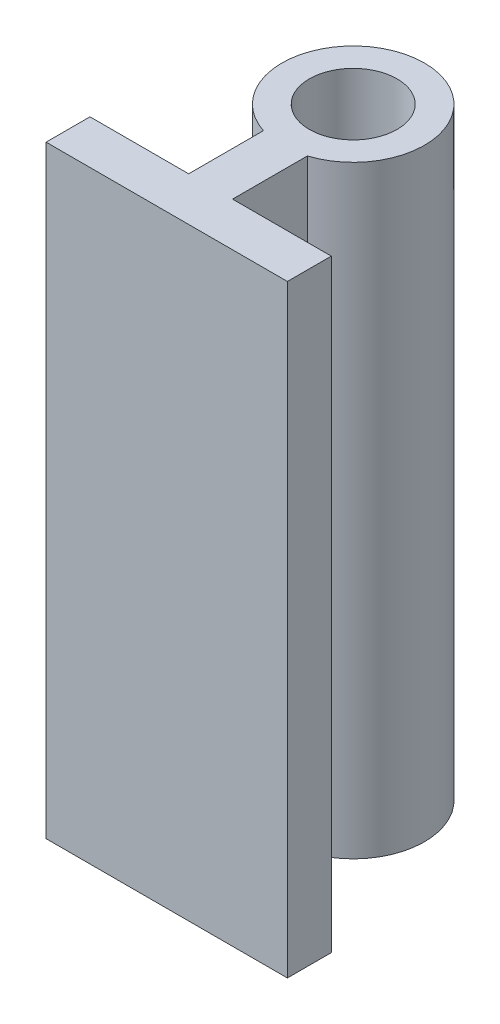
ISO-10303-21;
HEADER;
FILE_DESCRIPTION(('STEP AP214'),'2;1');
FILE_NAME('part.step','',(''),(''),'','','');
FILE_SCHEMA(('AUTOMOTIVE_DESIGN { 1 0 10303 214 1 1 1 1 }'));
ENDSEC;
DATA;
#1=APPLICATION_CONTEXT('core data for automotive mechanical design processes');
#2=APPLICATION_PROTOCOL_DEFINITION('international standard','automotive_design',2000,#1);
#3=PRODUCT_CONTEXT('',#1,'mechanical');
#4=PRODUCT('Part','Part','',(#3));
#5=PRODUCT_RELATED_PRODUCT_CATEGORY('part','',(#4));
#6=PRODUCT_DEFINITION_FORMATION('','',#4);
#7=PRODUCT_DEFINITION_CONTEXT('part definition',#1,'design');
#8=PRODUCT_DEFINITION('design','',#6,#7);
#9=PRODUCT_DEFINITION_SHAPE('','',#8);
#10=(LENGTH_UNIT() NAMED_UNIT(*) SI_UNIT(.MILLI.,.METRE.));
#11=(NAMED_UNIT(*) PLANE_ANGLE_UNIT() SI_UNIT($,.RADIAN.));
#12=(NAMED_UNIT(*) SI_UNIT($,.STERADIAN.) SOLID_ANGLE_UNIT());
#13=UNCERTAINTY_MEASURE_WITH_UNIT(LENGTH_MEASURE(1.E-05),#10,'distance_accuracy_value','');
#14=(GEOMETRIC_REPRESENTATION_CONTEXT(3) GLOBAL_UNCERTAINTY_ASSIGNED_CONTEXT((#13)) GLOBAL_UNIT_ASSIGNED_CONTEXT((#10,
#11,#12)) REPRESENTATION_CONTEXT('',''));
#15=CARTESIAN_POINT('',(0.,0.,0.));
#16=DIRECTION('',(0.,0.,1.));
#17=DIRECTION('',(1.,0.,0.));
#18=AXIS2_PLACEMENT_3D('',#15,#16,#17);
#19=CARTESIAN_POINT('',(0.,55.,0.));
#20=DIRECTION('',(0.,-1.,0.));
#21=DIRECTION('',(0.,0.,-1.));
#22=AXIS2_PLACEMENT_3D('',#19,#20,#21);
#23=CYLINDRICAL_SURFACE('',#22,4.);
#24=CARTESIAN_POINT('',(0.,0.,0.));
#25=DIRECTION('',(0.,1.,0.));
#26=DIRECTION('',(0.,0.,1.));
#27=AXIS2_PLACEMENT_3D('',#24,#25,#26);
#28=CIRCLE('',#27,4.);
#29=CARTESIAN_POINT('',(0.,0.,4.));
#30=VERTEX_POINT('',#29);
#31=EDGE_CURVE('E139',#30,#30,#28,.T.);
#32=ORIENTED_EDGE('',*,*,#31,.F.);
#33=EDGE_LOOP('',(#32));
#34=FACE_BOUND('',#33,.T.);
#35=CARTESIAN_POINT('',(0.,55.,0.));
#36=DIRECTION('',(0.,1.,0.));
#37=DIRECTION('',(0.,0.,1.));
#38=AXIS2_PLACEMENT_3D('',#35,#36,#37);
#39=CIRCLE('',#38,4.);
#40=CARTESIAN_POINT('',(0.,55.,4.));
#41=VERTEX_POINT('',#40);
#42=EDGE_CURVE('E122',#41,#41,#39,.T.);
#43=ORIENTED_EDGE('',*,*,#42,.T.);
#44=EDGE_LOOP('',(#43));
#45=FACE_BOUND('',#44,.T.);
#46=ADVANCED_FACE('F49',(#34,#45),#23,.F.);
#47=CARTESIAN_POINT('',(0.,55.,17.));
#48=DIRECTION('',(0.,0.,-1.));
#49=DIRECTION('',(-1.,0.,0.));
#50=AXIS2_PLACEMENT_3D('',#47,#48,#49);
#51=PLANE('',#50);
#52=DIRECTION('',(1.,0.,0.));
#53=VECTOR('',#52,1.);
#54=CARTESIAN_POINT('',(0.,0.,17.));
#55=LINE('',#54,#53);
#56=CARTESIAN_POINT('',(-11.,0.,17.));
#57=VERTEX_POINT('',#56);
#58=CARTESIAN_POINT('',(11.,0.,17.));
#59=VERTEX_POINT('',#58);
#60=EDGE_CURVE('E143',#57,#59,#55,.T.);
#61=ORIENTED_EDGE('',*,*,#60,.T.);
#62=DIRECTION('',(0.,-1.,0.));
#63=VECTOR('',#62,1.);
#64=CARTESIAN_POINT('',(11.,55.,17.));
#65=LINE('',#64,#63);
#66=CARTESIAN_POINT('',(11.,55.,17.));
#67=VERTEX_POINT('',#66);
#68=EDGE_CURVE('E13',#67,#59,#65,.T.);
#69=ORIENTED_EDGE('',*,*,#68,.F.);
#70=DIRECTION('',(1.,0.,0.));
#71=VECTOR('',#70,1.);
#72=CARTESIAN_POINT('',(0.,55.,17.));
#73=LINE('',#72,#71);
#74=CARTESIAN_POINT('',(-11.,55.,17.));
#75=VERTEX_POINT('',#74);
#76=EDGE_CURVE('E92',#75,#67,#73,.T.);
#77=ORIENTED_EDGE('',*,*,#76,.F.);
#78=DIRECTION('',(0.,-1.,0.));
#79=VECTOR('',#78,1.);
#80=CARTESIAN_POINT('',(-11.,55.,17.));
#81=LINE('',#80,#79);
#82=EDGE_CURVE('E119',#75,#57,#81,.T.);
#83=ORIENTED_EDGE('',*,*,#82,.T.);
#84=EDGE_LOOP('',(#61,#69,#77,#83));
#85=FACE_BOUND('',#84,.T.);
#86=ADVANCED_FACE('F117',(#85),#51,.F.);
#87=CARTESIAN_POINT('',(11.,55.,0.));
#88=DIRECTION('',(-1.,0.,0.));
#89=DIRECTION('',(0.,0.,1.));
#90=AXIS2_PLACEMENT_3D('',#87,#88,#89);
#91=PLANE('',#90);
#92=DIRECTION('',(0.,0.,-1.));
#93=VECTOR('',#92,1.);
#94=CARTESIAN_POINT('',(11.,0.,0.));
#95=LINE('',#94,#93);
#96=CARTESIAN_POINT('',(11.,0.,13.));
#97=VERTEX_POINT('',#96);
#98=EDGE_CURVE('E161',#59,#97,#95,.T.);
#99=ORIENTED_EDGE('',*,*,#98,.T.);
#100=DIRECTION('',(0.,-1.,0.));
#101=VECTOR('',#100,1.);
#102=CARTESIAN_POINT('',(11.,55.,13.));
#103=LINE('',#102,#101);
#104=CARTESIAN_POINT('',(11.,55.,13.));
#105=VERTEX_POINT('',#104);
#106=EDGE_CURVE('E57',#105,#97,#103,.T.);
#107=ORIENTED_EDGE('',*,*,#106,.F.);
#108=DIRECTION('',(0.,0.,-1.));
#109=VECTOR('',#108,1.);
#110=CARTESIAN_POINT('',(11.,55.,0.));
#111=LINE('',#110,#109);
#112=EDGE_CURVE('E121',#67,#105,#111,.T.);
#113=ORIENTED_EDGE('',*,*,#112,.F.);
#114=ORIENTED_EDGE('',*,*,#68,.T.);
#115=EDGE_LOOP('',(#99,#107,#113,#114));
#116=FACE_BOUND('',#115,.T.);
#117=ADVANCED_FACE('F178',(#116),#91,.F.);
#118=CARTESIAN_POINT('',(0.,55.,13.));
#119=DIRECTION('',(0.,0.,-1.));
#120=DIRECTION('',(-1.,0.,0.));
#121=AXIS2_PLACEMENT_3D('',#118,#119,#120);
#122=PLANE('',#121);
#123=DIRECTION('',(1.,0.,0.));
#124=VECTOR('',#123,1.);
#125=CARTESIAN_POINT('',(0.,0.,13.));
#126=LINE('',#125,#124);
#127=CARTESIAN_POINT('',(2.,0.,13.));
#128=VERTEX_POINT('',#127);
#129=EDGE_CURVE('E164',#128,#97,#126,.T.);
#130=ORIENTED_EDGE('',*,*,#129,.F.);
#131=DIRECTION('',(0.,-1.,0.));
#132=VECTOR('',#131,1.);
#133=CARTESIAN_POINT('',(2.,55.,13.));
#134=LINE('',#133,#132);
#135=CARTESIAN_POINT('',(2.,55.,13.));
#136=VERTEX_POINT('',#135);
#137=EDGE_CURVE('E80',#136,#128,#134,.T.);
#138=ORIENTED_EDGE('',*,*,#137,.F.);
#139=DIRECTION('',(1.,0.,0.));
#140=VECTOR('',#139,1.);
#141=CARTESIAN_POINT('',(0.,55.,13.));
#142=LINE('',#141,#140);
#143=EDGE_CURVE('E153',#136,#105,#142,.T.);
#144=ORIENTED_EDGE('',*,*,#143,.T.);
#145=ORIENTED_EDGE('',*,*,#106,.T.);
#146=EDGE_LOOP('',(#130,#138,#144,#145));
#147=FACE_BOUND('',#146,.T.);
#148=ADVANCED_FACE('F174',(#147),#122,.T.);
#149=CARTESIAN_POINT('',(2.,55.,0.));
#150=DIRECTION('',(1.,0.,0.));
#151=DIRECTION('',(0.,0.,-1.));
#152=AXIS2_PLACEMENT_3D('',#149,#150,#151);
#153=PLANE('',#152);
#154=DIRECTION('',(0.,0.,1.));
#155=VECTOR('',#154,1.);
#156=CARTESIAN_POINT('',(2.,0.,0.));
#157=LINE('',#156,#155);
#158=CARTESIAN_POINT('',(2.,0.,6.18465843842649));
#159=VERTEX_POINT('',#158);
#160=EDGE_CURVE('E167',#159,#128,#157,.T.);
#161=ORIENTED_EDGE('',*,*,#160,.F.);
#162=DIRECTION('',(0.,-1.,0.));
#163=VECTOR('',#162,1.);
#164=CARTESIAN_POINT('',(2.,55.,6.18465843842649));
#165=LINE('',#164,#163);
#166=CARTESIAN_POINT('',(2.,55.,6.18465843842649));
#167=VERTEX_POINT('',#166);
#168=EDGE_CURVE('E65',#167,#159,#165,.T.);
#169=ORIENTED_EDGE('',*,*,#168,.F.);
#170=DIRECTION('',(0.,0.,1.));
#171=VECTOR('',#170,1.);
#172=CARTESIAN_POINT('',(2.,55.,0.));
#173=LINE('',#172,#171);
#174=EDGE_CURVE('E156',#167,#136,#173,.T.);
#175=ORIENTED_EDGE('',*,*,#174,.T.);
#176=ORIENTED_EDGE('',*,*,#137,.T.);
#177=EDGE_LOOP('',(#161,#169,#175,#176));
#178=FACE_BOUND('',#177,.T.);
#179=ADVANCED_FACE('F183',(#178),#153,.T.);
#180=CARTESIAN_POINT('',(0.,55.,0.));
#181=DIRECTION('',(0.,-1.,0.));
#182=DIRECTION('',(0.,0.,-1.));
#183=AXIS2_PLACEMENT_3D('',#180,#181,#182);
#184=CYLINDRICAL_SURFACE('',#183,6.5);
#185=CARTESIAN_POINT('',(0.,0.,0.));
#186=DIRECTION('',(0.,1.,0.));
#187=DIRECTION('',(0.,0.,1.));
#188=AXIS2_PLACEMENT_3D('',#185,#186,#187);
#189=CIRCLE('',#188,6.5);
#190=CARTESIAN_POINT('',(-2.,0.,6.18465843842649));
#191=VERTEX_POINT('',#190);
#192=EDGE_CURVE('E150',#159,#191,#189,.T.);
#193=ORIENTED_EDGE('',*,*,#192,.T.);
#194=DIRECTION('',(0.,-1.,0.));
#195=VECTOR('',#194,1.);
#196=CARTESIAN_POINT('',(-2.,55.,6.18465843842649));
#197=LINE('',#196,#195);
#198=CARTESIAN_POINT('',(-2.,55.,6.18465843842649));
#199=VERTEX_POINT('',#198);
#200=EDGE_CURVE('E224',#199,#191,#197,.T.);
#201=ORIENTED_EDGE('',*,*,#200,.F.);
#202=CARTESIAN_POINT('',(0.,55.,0.));
#203=DIRECTION('',(0.,1.,0.));
#204=DIRECTION('',(0.,0.,1.));
#205=AXIS2_PLACEMENT_3D('',#202,#203,#204);
#206=CIRCLE('',#205,6.5);
#207=EDGE_CURVE('E158',#167,#199,#206,.T.);
#208=ORIENTED_EDGE('',*,*,#207,.F.);
#209=ORIENTED_EDGE('',*,*,#168,.T.);
#210=EDGE_LOOP('',(#193,#201,#208,#209));
#211=FACE_BOUND('',#210,.T.);
#212=ADVANCED_FACE('F185',(#211),#184,.T.);
#213=CARTESIAN_POINT('',(0.,55.,0.));
#214=DIRECTION('',(0.,1.,0.));
#215=DIRECTION('',(0.,0.,1.));
#216=AXIS2_PLACEMENT_3D('',#213,#214,#215);
#217=PLANE('',#216);
#218=DIRECTION('',(0.,0.,-1.));
#219=VECTOR('',#218,1.);
#220=CARTESIAN_POINT('',(-11.,55.,0.));
#221=LINE('',#220,#219);
#222=CARTESIAN_POINT('',(-11.,55.,13.));
#223=VERTEX_POINT('',#222);
#224=EDGE_CURVE('E125',#75,#223,#221,.T.);
#225=ORIENTED_EDGE('',*,*,#224,.F.);
#226=ORIENTED_EDGE('',*,*,#76,.T.);
#227=ORIENTED_EDGE('',*,*,#112,.T.);
#228=ORIENTED_EDGE('',*,*,#143,.F.);
#229=ORIENTED_EDGE('',*,*,#174,.F.);
#230=ORIENTED_EDGE('',*,*,#207,.T.);
#231=DIRECTION('',(0.,0.,1.));
#232=VECTOR('',#231,1.);
#233=CARTESIAN_POINT('',(-2.,55.,0.));
#234=LINE('',#233,#232);
#235=CARTESIAN_POINT('',(-2.,55.,13.));
#236=VERTEX_POINT('',#235);
#237=EDGE_CURVE('E232',#199,#236,#234,.T.);
#238=ORIENTED_EDGE('',*,*,#237,.T.);
#239=DIRECTION('',(-1.,0.,0.));
#240=VECTOR('',#239,1.);
#241=CARTESIAN_POINT('',(0.,55.,13.));
#242=LINE('',#241,#240);
#243=EDGE_CURVE('E129',#236,#223,#242,.T.);
#244=ORIENTED_EDGE('',*,*,#243,.T.);
#245=EDGE_LOOP('',(#225,#226,#227,#228,#229,#230,#238,#244));
#246=FACE_BOUND('',#245,.T.);
#247=ORIENTED_EDGE('',*,*,#42,.F.);
#248=EDGE_LOOP('',(#247));
#249=FACE_BOUND('',#248,.T.);
#250=ADVANCED_FACE('F126',(#246,#249),#217,.T.);
#251=CARTESIAN_POINT('',(0.,0.,0.));
#252=DIRECTION('',(0.,1.,0.));
#253=DIRECTION('',(0.,0.,1.));
#254=AXIS2_PLACEMENT_3D('',#251,#252,#253);
#255=PLANE('',#254);
#256=ORIENTED_EDGE('',*,*,#60,.F.);
#257=DIRECTION('',(0.,0.,-1.));
#258=VECTOR('',#257,1.);
#259=CARTESIAN_POINT('',(-11.,0.,0.));
#260=LINE('',#259,#258);
#261=CARTESIAN_POINT('',(-11.,0.,13.));
#262=VERTEX_POINT('',#261);
#263=EDGE_CURVE('E138',#57,#262,#260,.T.);
#264=ORIENTED_EDGE('',*,*,#263,.T.);
#265=DIRECTION('',(-1.,0.,0.));
#266=VECTOR('',#265,1.);
#267=CARTESIAN_POINT('',(0.,0.,13.));
#268=LINE('',#267,#266);
#269=CARTESIAN_POINT('',(-2.,0.,13.));
#270=VERTEX_POINT('',#269);
#271=EDGE_CURVE('E226',#270,#262,#268,.T.);
#272=ORIENTED_EDGE('',*,*,#271,.F.);
#273=DIRECTION('',(0.,0.,1.));
#274=VECTOR('',#273,1.);
#275=CARTESIAN_POINT('',(-2.,0.,0.));
#276=LINE('',#275,#274);
#277=EDGE_CURVE('E133',#191,#270,#276,.T.);
#278=ORIENTED_EDGE('',*,*,#277,.F.);
#279=ORIENTED_EDGE('',*,*,#192,.F.);
#280=ORIENTED_EDGE('',*,*,#160,.T.);
#281=ORIENTED_EDGE('',*,*,#129,.T.);
#282=ORIENTED_EDGE('',*,*,#98,.F.);
#283=EDGE_LOOP('',(#256,#264,#272,#278,#279,#280,#281,#282));
#284=FACE_BOUND('',#283,.T.);
#285=ORIENTED_EDGE('',*,*,#31,.T.);
#286=EDGE_LOOP('',(#285));
#287=FACE_BOUND('',#286,.T.);
#288=ADVANCED_FACE('F180',(#284,#287),#255,.F.);
#289=CARTESIAN_POINT('',(-11.,55.,0.));
#290=DIRECTION('',(1.,0.,0.));
#291=DIRECTION('',(0.,0.,1.));
#292=AXIS2_PLACEMENT_3D('',#289,#290,#291);
#293=PLANE('',#292);
#294=ORIENTED_EDGE('',*,*,#263,.F.);
#295=ORIENTED_EDGE('',*,*,#82,.F.);
#296=ORIENTED_EDGE('',*,*,#224,.T.);
#297=DIRECTION('',(0.,-1.,0.));
#298=VECTOR('',#297,1.);
#299=CARTESIAN_POINT('',(-11.,55.,13.));
#300=LINE('',#299,#298);
#301=EDGE_CURVE('E140',#223,#262,#300,.T.);
#302=ORIENTED_EDGE('',*,*,#301,.T.);
#303=EDGE_LOOP('',(#294,#295,#296,#302));
#304=FACE_BOUND('',#303,.T.);
#305=ADVANCED_FACE('F136',(#304),#293,.F.);
#306=CARTESIAN_POINT('',(0.,55.,13.));
#307=DIRECTION('',(0.,0.,-1.));
#308=DIRECTION('',(1.,0.,0.));
#309=AXIS2_PLACEMENT_3D('',#306,#307,#308);
#310=PLANE('',#309);
#311=ORIENTED_EDGE('',*,*,#271,.T.);
#312=ORIENTED_EDGE('',*,*,#301,.F.);
#313=ORIENTED_EDGE('',*,*,#243,.F.);
#314=DIRECTION('',(0.,-1.,0.));
#315=VECTOR('',#314,1.);
#316=CARTESIAN_POINT('',(-2.,55.,13.));
#317=LINE('',#316,#315);
#318=EDGE_CURVE('E145',#236,#270,#317,.T.);
#319=ORIENTED_EDGE('',*,*,#318,.T.);
#320=EDGE_LOOP('',(#311,#312,#313,#319));
#321=FACE_BOUND('',#320,.T.);
#322=ADVANCED_FACE('F210',(#321),#310,.T.);
#323=CARTESIAN_POINT('',(-2.,55.,0.));
#324=DIRECTION('',(-1.,0.,0.));
#325=DIRECTION('',(0.,0.,-1.));
#326=AXIS2_PLACEMENT_3D('',#323,#324,#325);
#327=PLANE('',#326);
#328=ORIENTED_EDGE('',*,*,#277,.T.);
#329=ORIENTED_EDGE('',*,*,#318,.F.);
#330=ORIENTED_EDGE('',*,*,#237,.F.);
#331=ORIENTED_EDGE('',*,*,#200,.T.);
#332=EDGE_LOOP('',(#328,#329,#330,#331));
#333=FACE_BOUND('',#332,.T.);
#334=ADVANCED_FACE('F213',(#333),#327,.T.);
#335=CLOSED_SHELL('',(#46,#86,#117,#148,#179,#212,#250,#288,#305,#322,#334));
#336=MANIFOLD_SOLID_BREP('B2',#335);
#337=ADVANCED_BREP_SHAPE_REPRESENTATION('',(#18,#336),#14);
#338=SHAPE_DEFINITION_REPRESENTATION(#9,#337);
ENDSEC;
END-ISO-10303-21;
